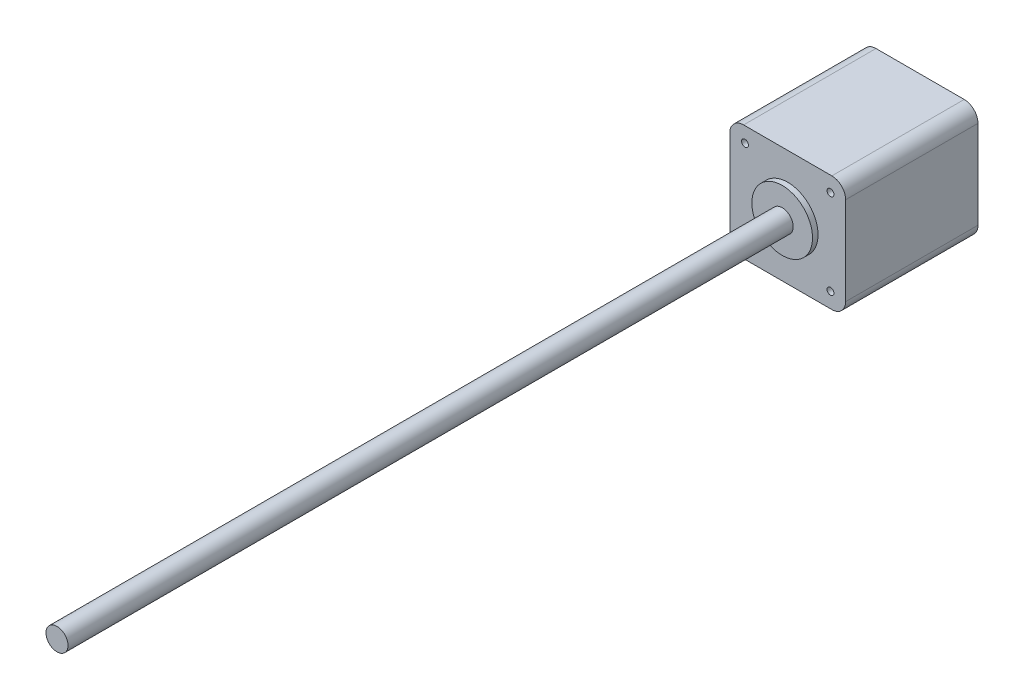
ISO-10303-21;
HEADER;
FILE_DESCRIPTION(('STEP AP214'),'2;1');
FILE_NAME('part.step','',(''),(''),'','','');
FILE_SCHEMA(('AUTOMOTIVE_DESIGN { 1 0 10303 214 1 1 1 1 }'));
ENDSEC;
DATA;
#1=APPLICATION_CONTEXT('core data for automotive mechanical design processes');
#2=APPLICATION_PROTOCOL_DEFINITION('international standard','automotive_design',2000,#1);
#3=PRODUCT_CONTEXT('',#1,'mechanical');
#4=PRODUCT('Part','Part','',(#3));
#5=PRODUCT_RELATED_PRODUCT_CATEGORY('part','',(#4));
#6=PRODUCT_DEFINITION_FORMATION('','',#4);
#7=PRODUCT_DEFINITION_CONTEXT('part definition',#1,'design');
#8=PRODUCT_DEFINITION('design','',#6,#7);
#9=PRODUCT_DEFINITION_SHAPE('','',#8);
#10=(LENGTH_UNIT() NAMED_UNIT(*) SI_UNIT(.MILLI.,.METRE.));
#11=(NAMED_UNIT(*) PLANE_ANGLE_UNIT() SI_UNIT($,.RADIAN.));
#12=(NAMED_UNIT(*) SI_UNIT($,.STERADIAN.) SOLID_ANGLE_UNIT());
#13=UNCERTAINTY_MEASURE_WITH_UNIT(LENGTH_MEASURE(1.E-05),#10,'distance_accuracy_value','');
#14=(GEOMETRIC_REPRESENTATION_CONTEXT(3) GLOBAL_UNCERTAINTY_ASSIGNED_CONTEXT((#13)) GLOBAL_UNIT_ASSIGNED_CONTEXT((#10,
#11,#12)) REPRESENTATION_CONTEXT('',''));
#15=CARTESIAN_POINT('',(0.,0.,0.));
#16=DIRECTION('',(0.,0.,1.));
#17=DIRECTION('',(1.,0.,0.));
#18=AXIS2_PLACEMENT_3D('',#15,#16,#17);
#19=CARTESIAN_POINT('',(-23.89928132844,0.,0.));
#20=DIRECTION('',(-1.,0.,0.));
#21=DIRECTION('',(0.,0.,1.));
#22=AXIS2_PLACEMENT_3D('',#19,#20,#21);
#23=PLANE('',#22);
#24=DIRECTION('',(0.,1.,0.));
#25=VECTOR('',#24,1.);
#26=CARTESIAN_POINT('',(-23.89928132844,57.52799013228,-47.4687918518535));
#27=LINE('',#26,#25);
#28=CARTESIAN_POINT('',(-23.89928132844,42.52799013228,-47.4687918518535));
#29=VERTEX_POINT('',#28);
#30=CARTESIAN_POINT('',(-23.89928132844,57.52799013228,-47.4687918518535));
#31=VERTEX_POINT('',#30);
#32=EDGE_CURVE('E202',#29,#31,#27,.T.);
#33=ORIENTED_EDGE('',*,*,#32,.T.);
#34=DIRECTION('',(0.,0.,-1.));
#35=VECTOR('',#34,1.);
#36=CARTESIAN_POINT('',(-23.89928132844,57.52799013228,-53.4687918518535));
#37=LINE('',#36,#35);
#38=CARTESIAN_POINT('',(-23.89928132844,57.52799013228,-53.4687918518535));
#39=VERTEX_POINT('',#38);
#40=EDGE_CURVE('E111',#31,#39,#37,.T.);
#41=ORIENTED_EDGE('',*,*,#40,.T.);
#42=DIRECTION('',(0.,1.,0.));
#43=VECTOR('',#42,1.);
#44=CARTESIAN_POINT('',(-23.89928132844,57.52799013228,-53.4687918518535));
#45=LINE('',#44,#43);
#46=CARTESIAN_POINT('',(-23.89928132844,42.52799013228,-53.4687918518535));
#47=VERTEX_POINT('',#46);
#48=EDGE_CURVE('E113',#39,#47,#45,.F.);
#49=ORIENTED_EDGE('',*,*,#48,.T.);
#50=DIRECTION('',(0.,0.,1.));
#51=VECTOR('',#50,1.);
#52=CARTESIAN_POINT('',(-23.89928132844,42.52799013228,-53.4687918518535));
#53=LINE('',#52,#51);
#54=EDGE_CURVE('E115',#47,#29,#53,.T.);
#55=ORIENTED_EDGE('',*,*,#54,.T.);
#56=EDGE_LOOP('',(#33,#41,#49,#55));
#57=FACE_BOUND('',#56,.T.);
#58=ADVANCED_FACE('F16',(#57),#23,.T.);
#59=CARTESIAN_POINT('',(-14.26978679048,63.65748467025,-14.40749147911));
#60=DIRECTION('',(0.,0.,1.));
#61=DIRECTION('',(1.,0.,0.));
#62=AXIS2_PLACEMENT_3D('',#59,#60,#61);
#63=PLANE('',#62);
#64=CARTESIAN_POINT('',(-12.39928132844,65.52799013228,-14.40749147911));
#65=DIRECTION('',(0.,0.,1.));
#66=DIRECTION('',(1.,0.,0.));
#67=AXIS2_PLACEMENT_3D('',#64,#65,#66);
#68=CIRCLE('',#67,1.25);
#69=CARTESIAN_POINT('',(-11.14928132844,65.52799013228,-14.40749147911));
#70=VERTEX_POINT('',#69);
#71=EDGE_CURVE('E19',#70,#70,#68,.T.);
#72=ORIENTED_EDGE('',*,*,#71,.T.);
#73=EDGE_LOOP('',(#72));
#74=FACE_BOUND('',#73,.T.);
#75=ADVANCED_FACE('F490',(#74),#63,.T.);
#76=CARTESIAN_POINT('',(16.73021320952,32.65748467025,-14.40749147911));
#77=DIRECTION('',(0.,0.,1.));
#78=DIRECTION('',(1.,0.,0.));
#79=AXIS2_PLACEMENT_3D('',#76,#77,#78);
#80=PLANE('',#79);
#81=CARTESIAN_POINT('',(18.60071867156,34.52799013228,-14.40749147911));
#82=DIRECTION('',(0.,0.,1.));
#83=DIRECTION('',(1.,0.,0.));
#84=AXIS2_PLACEMENT_3D('',#81,#82,#83);
#85=CIRCLE('',#84,1.25);
#86=CARTESIAN_POINT('',(19.85071867156,34.52799013228,-14.40749147911));
#87=VERTEX_POINT('',#86);
#88=EDGE_CURVE('E195',#87,#87,#85,.T.);
#89=ORIENTED_EDGE('',*,*,#88,.T.);
#90=EDGE_LOOP('',(#89));
#91=FACE_BOUND('',#90,.T.);
#92=ADVANCED_FACE('F481',(#91),#80,.T.);
#93=CARTESIAN_POINT('',(-14.26978679048,32.65748467025,-14.40749147911));
#94=DIRECTION('',(0.,0.,1.));
#95=DIRECTION('',(1.,0.,0.));
#96=AXIS2_PLACEMENT_3D('',#93,#94,#95);
#97=PLANE('',#96);
#98=CARTESIAN_POINT('',(-12.39928132844,34.52799013228,-14.40749147911));
#99=DIRECTION('',(0.,0.,1.));
#100=DIRECTION('',(1.,0.,0.));
#101=AXIS2_PLACEMENT_3D('',#98,#99,#100);
#102=CIRCLE('',#101,1.25);
#103=CARTESIAN_POINT('',(-11.14928132844,34.52799013228,-14.40749147911));
#104=VERTEX_POINT('',#103);
#105=EDGE_CURVE('E193',#104,#104,#102,.T.);
#106=ORIENTED_EDGE('',*,*,#105,.T.);
#107=EDGE_LOOP('',(#106));
#108=FACE_BOUND('',#107,.T.);
#109=ADVANCED_FACE('F472',(#108),#97,.T.);
#110=CARTESIAN_POINT('',(16.73021320952,63.65748467025,-14.40749147911));
#111=DIRECTION('',(0.,0.,1.));
#112=DIRECTION('',(1.,0.,0.));
#113=AXIS2_PLACEMENT_3D('',#110,#111,#112);
#114=PLANE('',#113);
#115=CARTESIAN_POINT('',(18.60071867156,65.52799013228,-14.40749147911));
#116=DIRECTION('',(0.,0.,1.));
#117=DIRECTION('',(1.,0.,0.));
#118=AXIS2_PLACEMENT_3D('',#115,#116,#117);
#119=CIRCLE('',#118,1.25);
#120=CARTESIAN_POINT('',(19.85071867156,65.52799013228,-14.40749147911));
#121=VERTEX_POINT('',#120);
#122=EDGE_CURVE('E190',#121,#121,#119,.T.);
#123=ORIENTED_EDGE('',*,*,#122,.T.);
#124=EDGE_LOOP('',(#123));
#125=FACE_BOUND('',#124,.T.);
#126=ADVANCED_FACE('F464',(#125),#114,.T.);
#127=CARTESIAN_POINT('',(-23.89928132844,42.52799013228,-53.4687918518535));
#128=DIRECTION('',(0.,1.,0.));
#129=DIRECTION('',(0.,0.,1.));
#130=AXIS2_PLACEMENT_3D('',#127,#128,#129);
#131=PLANE('',#130);
#132=DIRECTION('',(-1.,0.,0.));
#133=VECTOR('',#132,1.);
#134=CARTESIAN_POINT('',(-23.89928132844,42.52799013228,-47.4687918518535));
#135=LINE('',#134,#133);
#136=CARTESIAN_POINT('',(-17.89928132844,42.52799013228,-47.4687918518535));
#137=VERTEX_POINT('',#136);
#138=EDGE_CURVE('E126',#137,#29,#135,.T.);
#139=ORIENTED_EDGE('',*,*,#138,.T.);
#140=ORIENTED_EDGE('',*,*,#54,.F.);
#141=DIRECTION('',(1.,0.,0.));
#142=VECTOR('',#141,1.);
#143=CARTESIAN_POINT('',(-23.89928132844,42.52799013228,-53.4687918518535));
#144=LINE('',#143,#142);
#145=CARTESIAN_POINT('',(-17.89928132844,42.52799013228,-53.4687918518535));
#146=VERTEX_POINT('',#145);
#147=EDGE_CURVE('E120',#47,#146,#144,.T.);
#148=ORIENTED_EDGE('',*,*,#147,.T.);
#149=DIRECTION('',(0.,0.,1.));
#150=VECTOR('',#149,1.);
#151=CARTESIAN_POINT('',(-17.89928132844,42.52799013228,-62.57799694114));
#152=LINE('',#151,#150);
#153=EDGE_CURVE('E217',#137,#146,#152,.F.);
#154=ORIENTED_EDGE('',*,*,#153,.F.);
#155=EDGE_LOOP('',(#139,#140,#148,#154));
#156=FACE_BOUND('',#155,.T.);
#157=ADVANCED_FACE('F123',(#156),#131,.F.);
#158=CARTESIAN_POINT('',(-23.89928132844,57.52799013228,-53.4687918518535));
#159=DIRECTION('',(0.,0.,1.));
#160=DIRECTION('',(1.,0.,0.));
#161=AXIS2_PLACEMENT_3D('',#158,#159,#160);
#162=PLANE('',#161);
#163=ORIENTED_EDGE('',*,*,#147,.F.);
#164=ORIENTED_EDGE('',*,*,#48,.F.);
#165=DIRECTION('',(1.,0.,0.));
#166=VECTOR('',#165,1.);
#167=CARTESIAN_POINT('',(-23.89928132844,57.52799013228,-53.4687918518535));
#168=LINE('',#167,#166);
#169=CARTESIAN_POINT('',(-17.89928132844,57.52799013228,-53.4687918518535));
#170=VERTEX_POINT('',#169);
#171=EDGE_CURVE('E134',#39,#170,#168,.T.);
#172=ORIENTED_EDGE('',*,*,#171,.T.);
#173=DIRECTION('',(0.,1.,0.));
#174=VECTOR('',#173,1.);
#175=CARTESIAN_POINT('',(-17.89928132844,69.59849559431,-53.4687918518535));
#176=LINE('',#175,#174);
#177=EDGE_CURVE('E131',#146,#170,#176,.T.);
#178=ORIENTED_EDGE('',*,*,#177,.F.);
#179=EDGE_LOOP('',(#163,#164,#172,#178));
#180=FACE_BOUND('',#179,.T.);
#181=ADVANCED_FACE('F129',(#180),#162,.F.);
#182=CARTESIAN_POINT('',(-23.89928132844,57.52799013228,-53.4687918518535));
#183=DIRECTION('',(0.,-1.,0.));
#184=DIRECTION('',(0.,0.,-1.));
#185=AXIS2_PLACEMENT_3D('',#182,#183,#184);
#186=PLANE('',#185);
#187=ORIENTED_EDGE('',*,*,#171,.F.);
#188=ORIENTED_EDGE('',*,*,#40,.F.);
#189=DIRECTION('',(-1.,0.,0.));
#190=VECTOR('',#189,1.);
#191=CARTESIAN_POINT('',(-23.89928132844,57.52799013228,-47.4687918518535));
#192=LINE('',#191,#190);
#193=CARTESIAN_POINT('',(-17.89928132844,57.52799013228,-47.4687918518535));
#194=VERTEX_POINT('',#193);
#195=EDGE_CURVE('E91',#31,#194,#192,.F.);
#196=ORIENTED_EDGE('',*,*,#195,.T.);
#197=DIRECTION('',(0.,0.,1.));
#198=VECTOR('',#197,1.);
#199=CARTESIAN_POINT('',(-17.89928132844,57.52799013228,-62.57799694114));
#200=LINE('',#199,#198);
#201=EDGE_CURVE('E210',#170,#194,#200,.T.);
#202=ORIENTED_EDGE('',*,*,#201,.F.);
#203=EDGE_LOOP('',(#187,#188,#196,#202));
#204=FACE_BOUND('',#203,.T.);
#205=ADVANCED_FACE('F211',(#204),#186,.F.);
#206=CARTESIAN_POINT('',(-23.89928132844,57.52799013228,-47.4687918518535));
#207=DIRECTION('',(0.,0.,-1.));
#208=DIRECTION('',(-1.,0.,0.));
#209=AXIS2_PLACEMENT_3D('',#206,#207,#208);
#210=PLANE('',#209);
#211=ORIENTED_EDGE('',*,*,#195,.F.);
#212=ORIENTED_EDGE('',*,*,#32,.F.);
#213=ORIENTED_EDGE('',*,*,#138,.F.);
#214=DIRECTION('',(0.,1.,0.));
#215=VECTOR('',#214,1.);
#216=CARTESIAN_POINT('',(-17.89928132844,69.59849559431,-47.4687918518535));
#217=LINE('',#216,#215);
#218=EDGE_CURVE('E214',#194,#137,#217,.F.);
#219=ORIENTED_EDGE('',*,*,#218,.F.);
#220=EDGE_LOOP('',(#211,#212,#213,#219));
#221=FACE_BOUND('',#220,.T.);
#222=ADVANCED_FACE('F241',(#221),#210,.F.);
#223=CARTESIAN_POINT('',(-22.46978679048,24.45748467025,-57.40749147911));
#224=DIRECTION('',(0.,0.,-1.));
#225=DIRECTION('',(-1.,0.,0.));
#226=AXIS2_PLACEMENT_3D('',#223,#224,#225);
#227=PLANE('',#226);
#228=CARTESIAN_POINT('',(19.10071867156,34.02799013228,-57.40749147911));
#229=DIRECTION('',(0.,0.,-1.));
#230=DIRECTION('',(-1.,0.,0.));
#231=AXIS2_PLACEMENT_3D('',#228,#229,#230);
#232=CIRCLE('',#231,5.);
#233=CARTESIAN_POINT('',(19.10071867156,29.02799013228,-57.40749147911));
#234=VERTEX_POINT('',#233);
#235=CARTESIAN_POINT('',(24.10071867156,34.02799013228,-57.40749147911));
#236=VERTEX_POINT('',#235);
#237=EDGE_CURVE('E182',#234,#236,#232,.F.);
#238=ORIENTED_EDGE('',*,*,#237,.F.);
#239=DIRECTION('',(1.,0.,0.));
#240=VECTOR('',#239,1.);
#241=CARTESIAN_POINT('',(-16.46978679048,29.02799013228,-57.40749147911));
#242=LINE('',#241,#240);
#243=CARTESIAN_POINT('',(-12.89928132844,29.02799013228,-57.40749147911));
#244=VERTEX_POINT('',#243);
#245=EDGE_CURVE('E206',#244,#234,#242,.T.);
#246=ORIENTED_EDGE('',*,*,#245,.F.);
#247=CARTESIAN_POINT('',(-12.89928132844,34.02799013228,-57.40749147911));
#248=DIRECTION('',(0.,0.,-1.));
#249=DIRECTION('',(-1.,0.,0.));
#250=AXIS2_PLACEMENT_3D('',#247,#248,#249);
#251=CIRCLE('',#250,5.);
#252=CARTESIAN_POINT('',(-17.89928132844,34.02799013228,-57.40749147911));
#253=VERTEX_POINT('',#252);
#254=EDGE_CURVE('E186',#253,#244,#251,.F.);
#255=ORIENTED_EDGE('',*,*,#254,.F.);
#256=DIRECTION('',(0.,1.,0.));
#257=VECTOR('',#256,1.);
#258=CARTESIAN_POINT('',(-17.89928132844,69.59849559431,-57.40749147911));
#259=LINE('',#258,#257);
#260=CARTESIAN_POINT('',(-17.89928132844,66.02799013228,-57.40749147911));
#261=VERTEX_POINT('',#260);
#262=EDGE_CURVE('E81',#261,#253,#259,.F.);
#263=ORIENTED_EDGE('',*,*,#262,.F.);
#264=CARTESIAN_POINT('',(-12.89928132844,66.02799013228,-57.40749147911));
#265=DIRECTION('',(0.,0.,-1.));
#266=DIRECTION('',(-1.,0.,0.));
#267=AXIS2_PLACEMENT_3D('',#264,#265,#266);
#268=CIRCLE('',#267,5.);
#269=CARTESIAN_POINT('',(-12.89928132844,71.02799013228,-57.40749147911));
#270=VERTEX_POINT('',#269);
#271=EDGE_CURVE('E175',#270,#261,#268,.F.);
#272=ORIENTED_EDGE('',*,*,#271,.F.);
#273=DIRECTION('',(1.,0.,0.));
#274=VECTOR('',#273,1.);
#275=CARTESIAN_POINT('',(22.67122413359,71.02799013228,-57.40749147911));
#276=LINE('',#275,#274);
#277=CARTESIAN_POINT('',(19.10071867156,71.02799013228,-57.40749147911));
#278=VERTEX_POINT('',#277);
#279=EDGE_CURVE('E223',#278,#270,#276,.F.);
#280=ORIENTED_EDGE('',*,*,#279,.F.);
#281=CARTESIAN_POINT('',(19.10071867156,66.02799013228,-57.40749147911));
#282=DIRECTION('',(0.,0.,-1.));
#283=DIRECTION('',(-1.,0.,0.));
#284=AXIS2_PLACEMENT_3D('',#281,#282,#283);
#285=CIRCLE('',#284,5.);
#286=CARTESIAN_POINT('',(24.10071867156,66.02799013228,-57.40749147911));
#287=VERTEX_POINT('',#286);
#288=EDGE_CURVE('E178',#287,#278,#285,.F.);
#289=ORIENTED_EDGE('',*,*,#288,.F.);
#290=DIRECTION('',(0.,1.,0.));
#291=VECTOR('',#290,1.);
#292=CARTESIAN_POINT('',(24.10071867156,30.45748467025,-57.40749147911));
#293=LINE('',#292,#291);
#294=EDGE_CURVE('E224',#236,#287,#293,.T.);
#295=ORIENTED_EDGE('',*,*,#294,.F.);
#296=EDGE_LOOP('',(#238,#246,#255,#263,#272,#280,#289,#295));
#297=FACE_BOUND('',#296,.T.);
#298=ADVANCED_FACE('F243',(#297),#227,.T.);
#299=CARTESIAN_POINT('',(-12.39928132844,65.52799013228,-11.90749147911));
#300=DIRECTION('',(0.,0.,1.));
#301=DIRECTION('',(1.,0.,0.));
#302=AXIS2_PLACEMENT_3D('',#299,#300,#301);
#303=CYLINDRICAL_SURFACE('',#302,1.25);
#304=ORIENTED_EDGE('',*,*,#71,.F.);
#305=EDGE_LOOP('',(#304));
#306=FACE_BOUND('',#305,.T.);
#307=CARTESIAN_POINT('',(-12.39928132844,65.52799013228,-9.407491479105));
#308=DIRECTION('',(0.,0.,1.));
#309=DIRECTION('',(1.,0.,0.));
#310=AXIS2_PLACEMENT_3D('',#307,#308,#309);
#311=CIRCLE('',#310,1.25);
#312=CARTESIAN_POINT('',(-11.14928132844,65.52799013228,-9.407491479105));
#313=VERTEX_POINT('',#312);
#314=EDGE_CURVE('E171',#313,#313,#311,.F.);
#315=ORIENTED_EDGE('',*,*,#314,.F.);
#316=EDGE_LOOP('',(#315));
#317=FACE_BOUND('',#316,.T.);
#318=ADVANCED_FACE('F250',(#306,#317),#303,.F.);
#319=CARTESIAN_POINT('',(18.60071867156,34.52799013228,-11.90749147911));
#320=DIRECTION('',(0.,0.,1.));
#321=DIRECTION('',(1.,0.,0.));
#322=AXIS2_PLACEMENT_3D('',#319,#320,#321);
#323=CYLINDRICAL_SURFACE('',#322,1.25);
#324=ORIENTED_EDGE('',*,*,#88,.F.);
#325=EDGE_LOOP('',(#324));
#326=FACE_BOUND('',#325,.T.);
#327=CARTESIAN_POINT('',(18.60071867156,34.52799013228,-9.407491479105));
#328=DIRECTION('',(0.,0.,1.));
#329=DIRECTION('',(1.,0.,0.));
#330=AXIS2_PLACEMENT_3D('',#327,#328,#329);
#331=CIRCLE('',#330,1.25);
#332=CARTESIAN_POINT('',(19.85071867156,34.52799013228,-9.407491479105));
#333=VERTEX_POINT('',#332);
#334=EDGE_CURVE('E168',#333,#333,#331,.F.);
#335=ORIENTED_EDGE('',*,*,#334,.F.);
#336=EDGE_LOOP('',(#335));
#337=FACE_BOUND('',#336,.T.);
#338=ADVANCED_FACE('F313',(#326,#337),#323,.F.);
#339=CARTESIAN_POINT('',(-12.39928132844,34.52799013228,-11.90749147911));
#340=DIRECTION('',(0.,0.,1.));
#341=DIRECTION('',(1.,0.,0.));
#342=AXIS2_PLACEMENT_3D('',#339,#340,#341);
#343=CYLINDRICAL_SURFACE('',#342,1.25);
#344=ORIENTED_EDGE('',*,*,#105,.F.);
#345=EDGE_LOOP('',(#344));
#346=FACE_BOUND('',#345,.T.);
#347=CARTESIAN_POINT('',(-12.39928132844,34.52799013228,-9.407491479105));
#348=DIRECTION('',(0.,0.,1.));
#349=DIRECTION('',(1.,0.,0.));
#350=AXIS2_PLACEMENT_3D('',#347,#348,#349);
#351=CIRCLE('',#350,1.25);
#352=CARTESIAN_POINT('',(-11.14928132844,34.52799013228,-9.407491479105));
#353=VERTEX_POINT('',#352);
#354=EDGE_CURVE('E165',#353,#353,#351,.F.);
#355=ORIENTED_EDGE('',*,*,#354,.F.);
#356=EDGE_LOOP('',(#355));
#357=FACE_BOUND('',#356,.T.);
#358=ADVANCED_FACE('F309',(#346,#357),#343,.F.);
#359=CARTESIAN_POINT('',(18.60071867156,65.52799013228,-11.90749147911));
#360=DIRECTION('',(0.,0.,1.));
#361=DIRECTION('',(1.,0.,0.));
#362=AXIS2_PLACEMENT_3D('',#359,#360,#361);
#363=CYLINDRICAL_SURFACE('',#362,1.25);
#364=ORIENTED_EDGE('',*,*,#122,.F.);
#365=EDGE_LOOP('',(#364));
#366=FACE_BOUND('',#365,.T.);
#367=CARTESIAN_POINT('',(18.60071867156,65.52799013228,-9.407491479105));
#368=DIRECTION('',(0.,0.,1.));
#369=DIRECTION('',(1.,0.,0.));
#370=AXIS2_PLACEMENT_3D('',#367,#368,#369);
#371=CIRCLE('',#370,1.25);
#372=CARTESIAN_POINT('',(19.85071867156,65.52799013228,-9.407491479105));
#373=VERTEX_POINT('',#372);
#374=EDGE_CURVE('E162',#373,#373,#371,.F.);
#375=ORIENTED_EDGE('',*,*,#374,.F.);
#376=EDGE_LOOP('',(#375));
#377=FACE_BOUND('',#376,.T.);
#378=ADVANCED_FACE('F306',(#366,#377),#363,.F.);
#379=CARTESIAN_POINT('',(-17.89928132844,69.59849559431,-62.57799694114));
#380=DIRECTION('',(-1.,0.,0.));
#381=DIRECTION('',(0.,0.,1.));
#382=AXIS2_PLACEMENT_3D('',#379,#380,#381);
#383=PLANE('',#382);
#384=ORIENTED_EDGE('',*,*,#201,.T.);
#385=ORIENTED_EDGE('',*,*,#218,.T.);
#386=ORIENTED_EDGE('',*,*,#153,.T.);
#387=ORIENTED_EDGE('',*,*,#177,.T.);
#388=EDGE_LOOP('',(#384,#385,#386,#387));
#389=FACE_BOUND('',#388,.T.);
#390=DIRECTION('',(0.,1.,0.));
#391=VECTOR('',#390,1.);
#392=CARTESIAN_POINT('',(-17.89928132844,24.45748467025,-9.407491479105));
#393=LINE('',#392,#391);
#394=CARTESIAN_POINT('',(-17.89928132844,66.02799013228,-9.407491479105));
#395=VERTEX_POINT('',#394);
#396=CARTESIAN_POINT('',(-17.89928132844,34.02799013228,-9.407491479105));
#397=VERTEX_POINT('',#396);
#398=EDGE_CURVE('E161',#395,#397,#393,.F.);
#399=ORIENTED_EDGE('',*,*,#398,.F.);
#400=DIRECTION('',(0.,0.,-1.));
#401=VECTOR('',#400,1.);
#402=CARTESIAN_POINT('',(-17.89928132844,66.02799013228,-33.40749147911));
#403=LINE('',#402,#401);
#404=EDGE_CURVE('E174',#261,#395,#403,.F.);
#405=ORIENTED_EDGE('',*,*,#404,.F.);
#406=ORIENTED_EDGE('',*,*,#262,.T.);
#407=DIRECTION('',(0.,0.,-1.));
#408=VECTOR('',#407,1.);
#409=CARTESIAN_POINT('',(-17.89928132844,34.02799013228,-33.40749147911));
#410=LINE('',#409,#408);
#411=EDGE_CURVE('E189',#397,#253,#410,.T.);
#412=ORIENTED_EDGE('',*,*,#411,.F.);
#413=EDGE_LOOP('',(#399,#405,#406,#412));
#414=FACE_BOUND('',#413,.T.);
#415=ADVANCED_FACE('F216',(#389,#414),#383,.T.);
#416=CARTESIAN_POINT('',(-12.89928132844,34.02799013228,-33.40749147911));
#417=DIRECTION('',(0.,0.,-1.));
#418=DIRECTION('',(-1.,0.,0.));
#419=AXIS2_PLACEMENT_3D('',#416,#417,#418);
#420=CYLINDRICAL_SURFACE('',#419,5.);
#421=DIRECTION('',(0.,0.,-1.));
#422=VECTOR('',#421,1.);
#423=CARTESIAN_POINT('',(-12.89928132844,29.02799013228,-62.57799694114));
#424=LINE('',#423,#422);
#425=CARTESIAN_POINT('',(-12.89928132844,29.02799013228,-9.407491479105));
#426=VERTEX_POINT('',#425);
#427=EDGE_CURVE('E188',#426,#244,#424,.T.);
#428=ORIENTED_EDGE('',*,*,#427,.F.);
#429=CARTESIAN_POINT('',(-12.89928132844,34.02799013228,-9.407491479105));
#430=DIRECTION('',(0.,0.,-1.));
#431=DIRECTION('',(-1.,0.,0.));
#432=AXIS2_PLACEMENT_3D('',#429,#430,#431);
#433=CIRCLE('',#432,5.);
#434=EDGE_CURVE('E158',#397,#426,#433,.F.);
#435=ORIENTED_EDGE('',*,*,#434,.F.);
#436=ORIENTED_EDGE('',*,*,#411,.T.);
#437=ORIENTED_EDGE('',*,*,#254,.T.);
#438=EDGE_LOOP('',(#428,#435,#436,#437));
#439=FACE_BOUND('',#438,.T.);
#440=ADVANCED_FACE('F299',(#439),#420,.T.);
#441=CARTESIAN_POINT('',(-16.46978679048,29.02799013228,-62.57799694114));
#442=DIRECTION('',(0.,-1.,0.));
#443=DIRECTION('',(0.,0.,-1.));
#444=AXIS2_PLACEMENT_3D('',#441,#442,#443);
#445=PLANE('',#444);
#446=ORIENTED_EDGE('',*,*,#245,.T.);
#447=DIRECTION('',(0.,0.,-1.));
#448=VECTOR('',#447,1.);
#449=CARTESIAN_POINT('',(19.10071867156,29.02799013228,-33.40749147911));
#450=LINE('',#449,#448);
#451=CARTESIAN_POINT('',(19.10071867156,29.02799013228,-9.407491479105));
#452=VERTEX_POINT('',#451);
#453=EDGE_CURVE('E185',#452,#234,#450,.T.);
#454=ORIENTED_EDGE('',*,*,#453,.F.);
#455=DIRECTION('',(1.,0.,0.));
#456=VECTOR('',#455,1.);
#457=CARTESIAN_POINT('',(-22.46978679048,29.02799013228,-9.407491479105));
#458=LINE('',#457,#456);
#459=EDGE_CURVE('E157',#426,#452,#458,.T.);
#460=ORIENTED_EDGE('',*,*,#459,.F.);
#461=ORIENTED_EDGE('',*,*,#427,.T.);
#462=EDGE_LOOP('',(#446,#454,#460,#461));
#463=FACE_BOUND('',#462,.T.);
#464=ADVANCED_FACE('F295',(#463),#445,.T.);
#465=CARTESIAN_POINT('',(19.10071867156,34.02799013228,-33.40749147911));
#466=DIRECTION('',(0.,0.,-1.));
#467=DIRECTION('',(-1.,0.,0.));
#468=AXIS2_PLACEMENT_3D('',#465,#466,#467);
#469=CYLINDRICAL_SURFACE('',#468,5.);
#470=DIRECTION('',(0.,0.,-1.));
#471=VECTOR('',#470,1.);
#472=CARTESIAN_POINT('',(24.10071867156,34.02799013228,-62.57799694114));
#473=LINE('',#472,#471);
#474=CARTESIAN_POINT('',(24.10071867156,34.02799013228,-9.407491479105));
#475=VERTEX_POINT('',#474);
#476=EDGE_CURVE('E184',#475,#236,#473,.T.);
#477=ORIENTED_EDGE('',*,*,#476,.F.);
#478=CARTESIAN_POINT('',(19.10071867156,34.02799013228,-9.407491479105));
#479=DIRECTION('',(0.,0.,-1.));
#480=DIRECTION('',(-1.,0.,0.));
#481=AXIS2_PLACEMENT_3D('',#478,#479,#480);
#482=CIRCLE('',#481,5.);
#483=EDGE_CURVE('E154',#452,#475,#482,.F.);
#484=ORIENTED_EDGE('',*,*,#483,.F.);
#485=ORIENTED_EDGE('',*,*,#453,.T.);
#486=ORIENTED_EDGE('',*,*,#237,.T.);
#487=EDGE_LOOP('',(#477,#484,#485,#486));
#488=FACE_BOUND('',#487,.T.);
#489=ADVANCED_FACE('F292',(#488),#469,.T.);
#490=CARTESIAN_POINT('',(24.10071867156,30.45748467025,-62.57799694114));
#491=DIRECTION('',(1.,0.,0.));
#492=DIRECTION('',(0.,0.,-1.));
#493=AXIS2_PLACEMENT_3D('',#490,#491,#492);
#494=PLANE('',#493);
#495=ORIENTED_EDGE('',*,*,#294,.T.);
#496=DIRECTION('',(0.,0.,-1.));
#497=VECTOR('',#496,1.);
#498=CARTESIAN_POINT('',(24.10071867156,66.02799013228,-33.40749147911));
#499=LINE('',#498,#497);
#500=CARTESIAN_POINT('',(24.10071867156,66.02799013228,-9.407491479105));
#501=VERTEX_POINT('',#500);
#502=EDGE_CURVE('E181',#501,#287,#499,.T.);
#503=ORIENTED_EDGE('',*,*,#502,.F.);
#504=DIRECTION('',(0.,1.,0.));
#505=VECTOR('',#504,1.);
#506=CARTESIAN_POINT('',(24.10071867156,24.45748467025,-9.407491479105));
#507=LINE('',#506,#505);
#508=EDGE_CURVE('E153',#475,#501,#507,.T.);
#509=ORIENTED_EDGE('',*,*,#508,.F.);
#510=ORIENTED_EDGE('',*,*,#476,.T.);
#511=EDGE_LOOP('',(#495,#503,#509,#510));
#512=FACE_BOUND('',#511,.T.);
#513=ADVANCED_FACE('F288',(#512),#494,.T.);
#514=CARTESIAN_POINT('',(19.10071867156,66.02799013228,-33.40749147911));
#515=DIRECTION('',(0.,0.,-1.));
#516=DIRECTION('',(-1.,0.,0.));
#517=AXIS2_PLACEMENT_3D('',#514,#515,#516);
#518=CYLINDRICAL_SURFACE('',#517,5.);
#519=DIRECTION('',(0.,0.,1.));
#520=VECTOR('',#519,1.);
#521=CARTESIAN_POINT('',(19.10071867156,71.02799013228,-62.57799694114));
#522=LINE('',#521,#520);
#523=CARTESIAN_POINT('',(19.10071867156,71.02799013228,-9.407491479105));
#524=VERTEX_POINT('',#523);
#525=EDGE_CURVE('E180',#524,#278,#522,.F.);
#526=ORIENTED_EDGE('',*,*,#525,.F.);
#527=CARTESIAN_POINT('',(19.10071867156,66.02799013228,-9.407491479105));
#528=DIRECTION('',(0.,0.,-1.));
#529=DIRECTION('',(-1.,0.,0.));
#530=AXIS2_PLACEMENT_3D('',#527,#528,#529);
#531=CIRCLE('',#530,5.);
#532=EDGE_CURVE('E150',#501,#524,#531,.F.);
#533=ORIENTED_EDGE('',*,*,#532,.F.);
#534=ORIENTED_EDGE('',*,*,#502,.T.);
#535=ORIENTED_EDGE('',*,*,#288,.T.);
#536=EDGE_LOOP('',(#526,#533,#534,#535));
#537=FACE_BOUND('',#536,.T.);
#538=ADVANCED_FACE('F285',(#537),#518,.T.);
#539=CARTESIAN_POINT('',(22.67122413359,71.02799013228,-62.57799694114));
#540=DIRECTION('',(0.,1.,0.));
#541=DIRECTION('',(0.,0.,1.));
#542=AXIS2_PLACEMENT_3D('',#539,#540,#541);
#543=PLANE('',#542);
#544=ORIENTED_EDGE('',*,*,#279,.T.);
#545=DIRECTION('',(0.,0.,-1.));
#546=VECTOR('',#545,1.);
#547=CARTESIAN_POINT('',(-12.89928132844,71.02799013228,-33.40749147911));
#548=LINE('',#547,#546);
#549=CARTESIAN_POINT('',(-12.89928132844,71.02799013228,-9.407491479105));
#550=VERTEX_POINT('',#549);
#551=EDGE_CURVE('E34',#550,#270,#548,.T.);
#552=ORIENTED_EDGE('',*,*,#551,.F.);
#553=DIRECTION('',(1.,0.,0.));
#554=VECTOR('',#553,1.);
#555=CARTESIAN_POINT('',(-22.46978679048,71.02799013228,-9.407491479105));
#556=LINE('',#555,#554);
#557=EDGE_CURVE('E149',#524,#550,#556,.F.);
#558=ORIENTED_EDGE('',*,*,#557,.F.);
#559=ORIENTED_EDGE('',*,*,#525,.T.);
#560=EDGE_LOOP('',(#544,#552,#558,#559));
#561=FACE_BOUND('',#560,.T.);
#562=ADVANCED_FACE('F281',(#561),#543,.T.);
#563=CARTESIAN_POINT('',(-12.89928132844,66.02799013228,-33.40749147911));
#564=DIRECTION('',(0.,0.,-1.));
#565=DIRECTION('',(-1.,0.,0.));
#566=AXIS2_PLACEMENT_3D('',#563,#564,#565);
#567=CYLINDRICAL_SURFACE('',#566,5.);
#568=ORIENTED_EDGE('',*,*,#404,.T.);
#569=CARTESIAN_POINT('',(-12.89928132844,66.02799013228,-9.407491479105));
#570=DIRECTION('',(0.,0.,-1.));
#571=DIRECTION('',(-1.,0.,0.));
#572=AXIS2_PLACEMENT_3D('',#569,#570,#571);
#573=CIRCLE('',#572,5.);
#574=EDGE_CURVE('E146',#550,#395,#573,.F.);
#575=ORIENTED_EDGE('',*,*,#574,.F.);
#576=ORIENTED_EDGE('',*,*,#551,.T.);
#577=ORIENTED_EDGE('',*,*,#271,.T.);
#578=EDGE_LOOP('',(#568,#575,#576,#577));
#579=FACE_BOUND('',#578,.T.);
#580=ADVANCED_FACE('F277',(#579),#567,.T.);
#581=CARTESIAN_POINT('',(-22.46978679048,24.45748467025,-9.407491479105));
#582=DIRECTION('',(0.,0.,1.));
#583=DIRECTION('',(1.,0.,0.));
#584=AXIS2_PLACEMENT_3D('',#581,#582,#583);
#585=PLANE('',#584);
#586=ORIENTED_EDGE('',*,*,#557,.T.);
#587=ORIENTED_EDGE('',*,*,#574,.T.);
#588=ORIENTED_EDGE('',*,*,#398,.T.);
#589=ORIENTED_EDGE('',*,*,#434,.T.);
#590=ORIENTED_EDGE('',*,*,#459,.T.);
#591=ORIENTED_EDGE('',*,*,#483,.T.);
#592=ORIENTED_EDGE('',*,*,#508,.T.);
#593=ORIENTED_EDGE('',*,*,#532,.T.);
#594=EDGE_LOOP('',(#586,#587,#588,#589,#590,#591,#592,#593));
#595=FACE_BOUND('',#594,.T.);
#596=ORIENTED_EDGE('',*,*,#374,.T.);
#597=EDGE_LOOP('',(#596));
#598=FACE_BOUND('',#597,.T.);
#599=ORIENTED_EDGE('',*,*,#354,.T.);
#600=EDGE_LOOP('',(#599));
#601=FACE_BOUND('',#600,.T.);
#602=ORIENTED_EDGE('',*,*,#334,.T.);
#603=EDGE_LOOP('',(#602));
#604=FACE_BOUND('',#603,.T.);
#605=ORIENTED_EDGE('',*,*,#314,.T.);
#606=EDGE_LOOP('',(#605));
#607=FACE_BOUND('',#606,.T.);
#608=CARTESIAN_POINT('',(3.100718671558,50.02799013228,-9.407491479105));
#609=DIRECTION('',(0.,0.,-1.));
#610=DIRECTION('',(-1.,0.,0.));
#611=AXIS2_PLACEMENT_3D('',#608,#609,#610);
#612=CIRCLE('',#611,11.);
#613=CARTESIAN_POINT('',(-7.899281328442,50.02799013228,-9.407491479105));
#614=VERTEX_POINT('',#613);
#615=EDGE_CURVE('E143',#614,#614,#612,.F.);
#616=ORIENTED_EDGE('',*,*,#615,.F.);
#617=EDGE_LOOP('',(#616));
#618=FACE_BOUND('',#617,.T.);
#619=ADVANCED_FACE('F273',(#595,#598,#601,#604,#607,#618),#585,.T.);
#620=CARTESIAN_POINT('',(3.100718671558,50.02799013228,-7.407491479105));
#621=DIRECTION('',(0.,0.,-1.));
#622=DIRECTION('',(-1.,0.,0.));
#623=AXIS2_PLACEMENT_3D('',#620,#621,#622);
#624=CYLINDRICAL_SURFACE('',#623,11.);
#625=ORIENTED_EDGE('',*,*,#615,.T.);
#626=EDGE_LOOP('',(#625));
#627=FACE_BOUND('',#626,.T.);
#628=CARTESIAN_POINT('',(3.100718671558,50.02799013228,-7.407491479105));
#629=DIRECTION('',(0.,0.,-1.));
#630=DIRECTION('',(-1.,0.,0.));
#631=AXIS2_PLACEMENT_3D('',#628,#629,#630);
#632=CIRCLE('',#631,11.);
#633=CARTESIAN_POINT('',(-7.899281328442,50.02799013228,-7.407491479105));
#634=VERTEX_POINT('',#633);
#635=EDGE_CURVE('E140',#634,#634,#632,.F.);
#636=ORIENTED_EDGE('',*,*,#635,.F.);
#637=EDGE_LOOP('',(#636));
#638=FACE_BOUND('',#637,.T.);
#639=ADVANCED_FACE('F269',(#627,#638),#624,.T.);
#640=CARTESIAN_POINT('',(3.100718671558,50.02799013228,-7.407491479105));
#641=DIRECTION('',(0.,0.,1.));
#642=DIRECTION('',(1.,0.,0.));
#643=AXIS2_PLACEMENT_3D('',#640,#641,#642);
#644=PLANE('',#643);
#645=ORIENTED_EDGE('',*,*,#635,.T.);
#646=EDGE_LOOP('',(#645));
#647=FACE_BOUND('',#646,.T.);
#648=CARTESIAN_POINT('',(3.100718671558,50.02799013228,-7.40749147910499));
#649=DIRECTION('',(0.,0.,1.));
#650=DIRECTION('',(1.,0.,0.));
#651=AXIS2_PLACEMENT_3D('',#648,#649,#650);
#652=CIRCLE('',#651,4.);
#653=CARTESIAN_POINT('',(7.100718671558,50.02799013228,-7.40749147910499));
#654=VERTEX_POINT('',#653);
#655=EDGE_CURVE('E25',#654,#654,#652,.T.);
#656=ORIENTED_EDGE('',*,*,#655,.F.);
#657=EDGE_LOOP('',(#656));
#658=FACE_BOUND('',#657,.T.);
#659=ADVANCED_FACE('F262',(#647,#658),#644,.T.);
#660=CARTESIAN_POINT('',(-2.069786790476,44.85748467025,255.5925085209));
#661=DIRECTION('',(0.,0.,1.));
#662=DIRECTION('',(1.,0.,0.));
#663=AXIS2_PLACEMENT_3D('',#660,#661,#662);
#664=PLANE('',#663);
#665=CARTESIAN_POINT('',(3.100718671558,50.02799013228,255.5925085209));
#666=DIRECTION('',(0.,0.,1.));
#667=DIRECTION('',(1.,0.,0.));
#668=AXIS2_PLACEMENT_3D('',#665,#666,#667);
#669=CIRCLE('',#668,4.);
#670=CARTESIAN_POINT('',(7.100718671558,50.02799013228,255.5925085209));
#671=VERTEX_POINT('',#670);
#672=EDGE_CURVE('E11',#671,#671,#669,.F.);
#673=ORIENTED_EDGE('',*,*,#672,.F.);
#674=EDGE_LOOP('',(#673));
#675=FACE_BOUND('',#674,.T.);
#676=ADVANCED_FACE('F256',(#675),#664,.T.);
#677=CARTESIAN_POINT('',(3.100718671558,50.02799013228,118.0925085209));
#678=DIRECTION('',(0.,0.,1.));
#679=DIRECTION('',(1.,0.,0.));
#680=AXIS2_PLACEMENT_3D('',#677,#678,#679);
#681=CYLINDRICAL_SURFACE('',#680,4.);
#682=ORIENTED_EDGE('',*,*,#672,.T.);
#683=EDGE_LOOP('',(#682));
#684=FACE_BOUND('',#683,.T.);
#685=ORIENTED_EDGE('',*,*,#655,.T.);
#686=EDGE_LOOP('',(#685));
#687=FACE_BOUND('',#686,.T.);
#688=ADVANCED_FACE('F254',(#684,#687),#681,.T.);
#689=CLOSED_SHELL('',(#58,#75,#92,#109,#126,#157,#181,#205,#222,#298,#318,#338,#358,#378,#415,
#440,#464,#489,#513,#538,#562,#580,#619,#639,#659,#676,#688));
#690=MANIFOLD_SOLID_BREP('B1',#689);
#691=ADVANCED_BREP_SHAPE_REPRESENTATION('',(#18,#690),#14);
#692=SHAPE_DEFINITION_REPRESENTATION(#9,#691);
ENDSEC;
END-ISO-10303-21;
